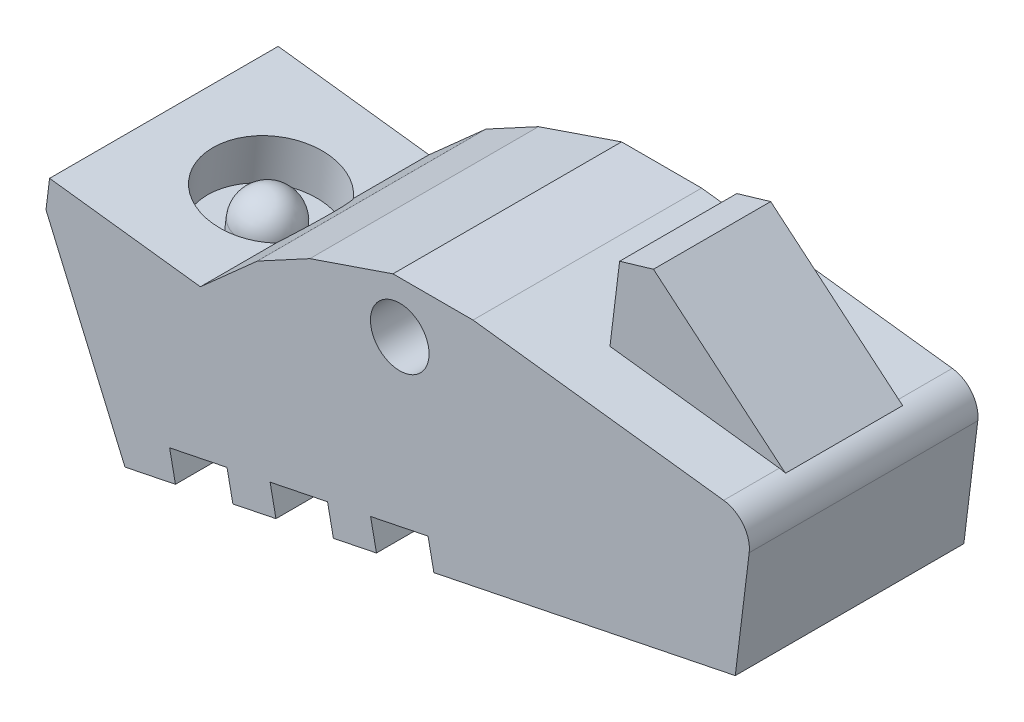
ISO-10303-21;
HEADER;
FILE_DESCRIPTION(('STEP AP214'),'2;1');
FILE_NAME('part.step','',(''),(''),'','','');
FILE_SCHEMA(('AUTOMOTIVE_DESIGN { 1 0 10303 214 1 1 1 1 }'));
ENDSEC;
DATA;
#1=APPLICATION_CONTEXT('core data for automotive mechanical design processes');
#2=APPLICATION_PROTOCOL_DEFINITION('international standard','automotive_design',2000,#1);
#3=PRODUCT_CONTEXT('',#1,'mechanical');
#4=PRODUCT('Part','Part','',(#3));
#5=PRODUCT_RELATED_PRODUCT_CATEGORY('part','',(#4));
#6=PRODUCT_DEFINITION_FORMATION('','',#4);
#7=PRODUCT_DEFINITION_CONTEXT('part definition',#1,'design');
#8=PRODUCT_DEFINITION('design','',#6,#7);
#9=PRODUCT_DEFINITION_SHAPE('','',#8);
#10=(LENGTH_UNIT() NAMED_UNIT(*) SI_UNIT(.MILLI.,.METRE.));
#11=(NAMED_UNIT(*) PLANE_ANGLE_UNIT() SI_UNIT($,.RADIAN.));
#12=(NAMED_UNIT(*) SI_UNIT($,.STERADIAN.) SOLID_ANGLE_UNIT());
#13=UNCERTAINTY_MEASURE_WITH_UNIT(LENGTH_MEASURE(1.E-05),#10,'distance_accuracy_value','');
#14=(GEOMETRIC_REPRESENTATION_CONTEXT(3) GLOBAL_UNCERTAINTY_ASSIGNED_CONTEXT((#13)) GLOBAL_UNIT_ASSIGNED_CONTEXT((#10,
#11,#12)) REPRESENTATION_CONTEXT('',''));
#15=CARTESIAN_POINT('',(0.,0.,0.));
#16=DIRECTION('',(0.,0.,1.));
#17=DIRECTION('',(1.,0.,0.));
#18=AXIS2_PLACEMENT_3D('',#15,#16,#17);
#19=CARTESIAN_POINT('',(1.29657157623182,-6.35535540642617,7.8));
#20=DIRECTION('',(-0.199894928035445,0.97981733896972,0.));
#21=DIRECTION('',(-0.97981733896972,-0.199894928035445,0.));
#22=AXIS2_PLACEMENT_3D('',#19,#20,#21);
#23=PLANE('',#22);
#24=DIRECTION('',(0.97981733896972,0.199894928035445,0.));
#25=VECTOR('',#24,1.);
#26=CARTESIAN_POINT('',(1.29657157623182,-6.35535540642617,0.));
#27=LINE('',#26,#25);
#28=CARTESIAN_POINT('',(-2.26401181136347,-7.08175871826791,0.));
#29=VERTEX_POINT('',#28);
#30=CARTESIAN_POINT('',(-0.794285802908892,-6.78191632621474,0.));
#31=VERTEX_POINT('',#30);
#32=EDGE_CURVE('E488',#29,#31,#27,.T.);
#33=ORIENTED_EDGE('',*,*,#32,.T.);
#34=DIRECTION('',(0.,0.,-1.));
#35=VECTOR('',#34,1.);
#36=CARTESIAN_POINT('',(-0.794285802908892,-6.78191632621474,7.8));
#37=LINE('',#36,#35);
#38=CARTESIAN_POINT('',(-0.794285802908892,-6.78191632621474,7.8));
#39=VERTEX_POINT('',#38);
#40=EDGE_CURVE('E518',#39,#31,#37,.T.);
#41=ORIENTED_EDGE('',*,*,#40,.F.);
#42=DIRECTION('',(0.97981733896972,0.199894928035445,0.));
#43=VECTOR('',#42,1.);
#44=CARTESIAN_POINT('',(1.29657157623182,-6.35535540642617,7.8));
#45=LINE('',#44,#43);
#46=CARTESIAN_POINT('',(-2.26401181136347,-7.08175871826791,7.8));
#47=VERTEX_POINT('',#46);
#48=EDGE_CURVE('E512',#47,#39,#45,.T.);
#49=ORIENTED_EDGE('',*,*,#48,.F.);
#50=DIRECTION('',(0.,0.,1.));
#51=VECTOR('',#50,1.);
#52=CARTESIAN_POINT('',(-2.26401181136347,-7.08175871826791,7.8));
#53=LINE('',#52,#51);
#54=EDGE_CURVE('E261',#29,#47,#53,.T.);
#55=ORIENTED_EDGE('',*,*,#54,.F.);
#56=EDGE_LOOP('',(#33,#41,#49,#55));
#57=FACE_BOUND('',#56,.T.);
#58=ADVANCED_FACE('F35',(#57),#23,.F.);
#59=CARTESIAN_POINT('',(-5.69337249775749,-7.78139096639197,0.));
#60=VERTEX_POINT('',#59);
#61=CARTESIAN_POINT('',(-4.22364648930291,-7.4815485743388,0.));
#62=VERTEX_POINT('',#61);
#63=EDGE_CURVE('E393',#60,#62,#27,.T.);
#64=ORIENTED_EDGE('',*,*,#63,.T.);
#65=DIRECTION('',(0.,0.,-1.));
#66=VECTOR('',#65,1.);
#67=CARTESIAN_POINT('',(-4.22364648930292,-7.4815485743388,7.8));
#68=LINE('',#67,#66);
#69=CARTESIAN_POINT('',(-4.22364648930292,-7.4815485743388,7.8));
#70=VERTEX_POINT('',#69);
#71=EDGE_CURVE('E271',#70,#62,#68,.T.);
#72=ORIENTED_EDGE('',*,*,#71,.F.);
#73=CARTESIAN_POINT('',(-5.69337249775749,-7.78139096639197,7.8));
#74=VERTEX_POINT('',#73);
#75=EDGE_CURVE('E360',#74,#70,#45,.T.);
#76=ORIENTED_EDGE('',*,*,#75,.F.);
#77=DIRECTION('',(0.,0.,1.));
#78=VECTOR('',#77,1.);
#79=CARTESIAN_POINT('',(-5.69337249775749,-7.78139096639197,7.8));
#80=LINE('',#79,#78);
#81=EDGE_CURVE('E287',#60,#74,#80,.T.);
#82=ORIENTED_EDGE('',*,*,#81,.F.);
#83=EDGE_LOOP('',(#64,#72,#76,#82));
#84=FACE_BOUND('',#83,.T.);
#85=ADVANCED_FACE('F499',(#84),#23,.F.);
#86=CARTESIAN_POINT('',(-9.37544654066765,-8.53257988350446,0.));
#87=VERTEX_POINT('',#86);
#88=CARTESIAN_POINT('',(-7.65300717569693,-8.18118082246286,0.));
#89=VERTEX_POINT('',#88);
#90=EDGE_CURVE('E389',#87,#89,#27,.T.);
#91=ORIENTED_EDGE('',*,*,#90,.T.);
#92=DIRECTION('',(0.,0.,-1.));
#93=VECTOR('',#92,1.);
#94=CARTESIAN_POINT('',(-7.65300717569693,-8.18118082246286,7.8));
#95=LINE('',#94,#93);
#96=CARTESIAN_POINT('',(-7.65300717569693,-8.18118082246286,7.8));
#97=VERTEX_POINT('',#96);
#98=EDGE_CURVE('E276',#97,#89,#95,.T.);
#99=ORIENTED_EDGE('',*,*,#98,.F.);
#100=CARTESIAN_POINT('',(-9.37544654066765,-8.53257988350446,7.8));
#101=VERTEX_POINT('',#100);
#102=EDGE_CURVE('E356',#101,#97,#45,.T.);
#103=ORIENTED_EDGE('',*,*,#102,.F.);
#104=DIRECTION('',(0.,0.,-1.));
#105=VECTOR('',#104,1.);
#106=CARTESIAN_POINT('',(-9.37544654066765,-8.53257988350446,7.8));
#107=LINE('',#106,#105);
#108=EDGE_CURVE('E400',#101,#87,#107,.T.);
#109=ORIENTED_EDGE('',*,*,#108,.T.);
#110=EDGE_LOOP('',(#91,#99,#103,#109));
#111=FACE_BOUND('',#110,.T.);
#112=ADVANCED_FACE('F539',(#111),#23,.F.);
#113=CARTESIAN_POINT('',(0.248812000804471,2.0264111299909,7.8));
#114=DIRECTION('',(0.121869343405041,0.992546151641335,0.));
#115=DIRECTION('',(-0.992546151641335,0.121869343405041,0.));
#116=AXIS2_PLACEMENT_3D('',#113,#114,#115);
#117=PLANE('',#116);
#118=DIRECTION('',(0.992546151641335,-0.121869343405041,0.));
#119=VECTOR('',#118,1.);
#120=CARTESIAN_POINT('',(0.248812000804471,2.0264111299909,7.8));
#121=LINE('',#120,#119);
#122=CARTESIAN_POINT('',(2.5,1.75000000000003,7.8));
#123=VERTEX_POINT('',#122);
#124=CARTESIAN_POINT('',(11.0530836565726,0.699813378862885,7.8));
#125=VERTEX_POINT('',#124);
#126=EDGE_CURVE('E362',#123,#125,#121,.T.);
#127=ORIENTED_EDGE('',*,*,#126,.T.);
#128=DIRECTION('',(0.,0.,-1.));
#129=VECTOR('',#128,1.);
#130=CARTESIAN_POINT('',(11.0530836565726,0.699813378862885,7.8));
#131=LINE('',#130,#129);
#132=CARTESIAN_POINT('',(11.0530836565725,0.699813378861765,5.9));
#133=VERTEX_POINT('',#132);
#134=EDGE_CURVE('E436',#125,#133,#131,.T.);
#135=ORIENTED_EDGE('',*,*,#134,.T.);
#136=DIRECTION('',(0.992546151641322,-0.121869343405144,0.));
#137=VECTOR('',#136,1.);
#138=CARTESIAN_POINT('',(5.27319145931153,1.40949490436855,5.9));
#139=LINE('',#138,#137);
#140=CARTESIAN_POINT('',(5.27319145931153,1.40949490436908,5.9));
#141=VERTEX_POINT('',#140);
#142=EDGE_CURVE('E322',#141,#133,#139,.T.);
#143=ORIENTED_EDGE('',*,*,#142,.F.);
#144=DIRECTION('',(0.,0.,1.));
#145=VECTOR('',#144,1.);
#146=CARTESIAN_POINT('',(5.27319145931153,1.40949490436855,1.9));
#147=LINE('',#146,#145);
#148=CARTESIAN_POINT('',(5.27319145931153,1.40949490436855,1.9));
#149=VERTEX_POINT('',#148);
#150=EDGE_CURVE('E319',#149,#141,#147,.T.);
#151=ORIENTED_EDGE('',*,*,#150,.F.);
#152=DIRECTION('',(-0.992546151641322,0.121869343405144,0.));
#153=VECTOR('',#152,1.);
#154=CARTESIAN_POINT('',(5.27319145931153,1.40949490436855,1.9));
#155=LINE('',#154,#153);
#156=CARTESIAN_POINT('',(11.0530836565725,0.699813378861765,1.9));
#157=VERTEX_POINT('',#156);
#158=EDGE_CURVE('E317',#157,#149,#155,.T.);
#159=ORIENTED_EDGE('',*,*,#158,.F.);
#160=DIRECTION('',(0.,0.,-1.));
#161=VECTOR('',#160,1.);
#162=CARTESIAN_POINT('',(11.0530836565726,0.699813378862885,7.8));
#163=LINE('',#162,#161);
#164=CARTESIAN_POINT('',(11.0530836565726,0.699813378862885,0.));
#165=VERTEX_POINT('',#164);
#166=EDGE_CURVE('E434',#157,#165,#163,.T.);
#167=ORIENTED_EDGE('',*,*,#166,.T.);
#168=DIRECTION('',(0.992546151641335,-0.121869343405041,0.));
#169=VECTOR('',#168,1.);
#170=CARTESIAN_POINT('',(0.248812000804471,2.0264111299909,0.));
#171=LINE('',#170,#169);
#172=CARTESIAN_POINT('',(2.5,1.75000000000003,0.));
#173=VERTEX_POINT('',#172);
#174=EDGE_CURVE('E335',#173,#165,#171,.T.);
#175=ORIENTED_EDGE('',*,*,#174,.F.);
#176=DIRECTION('',(0.,0.,-1.));
#177=VECTOR('',#176,1.);
#178=CARTESIAN_POINT('',(2.5,1.75000000000003,7.8));
#179=LINE('',#178,#177);
#180=EDGE_CURVE('E365',#123,#173,#179,.T.);
#181=ORIENTED_EDGE('',*,*,#180,.F.);
#182=EDGE_LOOP('',(#127,#135,#143,#151,#159,#167,#175,#181));
#183=FACE_BOUND('',#182,.T.);
#184=ADVANCED_FACE('F458',(#183),#117,.T.);
#185=CARTESIAN_POINT('',(0.,1.75000000000004,7.8));
#186=DIRECTION('',(0.,1.,0.));
#187=DIRECTION('',(-1.,0.,0.));
#188=AXIS2_PLACEMENT_3D('',#185,#186,#187);
#189=PLANE('',#188);
#190=DIRECTION('',(1.,0.,0.));
#191=VECTOR('',#190,1.);
#192=CARTESIAN_POINT('',(0.,1.75000000000004,0.));
#193=LINE('',#192,#191);
#194=CARTESIAN_POINT('',(-0.230903775001697,1.75000000000004,0.));
#195=VERTEX_POINT('',#194);
#196=EDGE_CURVE('E368',#195,#173,#193,.T.);
#197=ORIENTED_EDGE('',*,*,#196,.F.);
#198=DIRECTION('',(0.,0.,-1.));
#199=VECTOR('',#198,1.);
#200=CARTESIAN_POINT('',(-0.230903775001697,1.75000000000004,7.8));
#201=LINE('',#200,#199);
#202=CARTESIAN_POINT('',(-0.230903775001697,1.75000000000004,7.8));
#203=VERTEX_POINT('',#202);
#204=EDGE_CURVE('E417',#203,#195,#201,.T.);
#205=ORIENTED_EDGE('',*,*,#204,.F.);
#206=DIRECTION('',(1.,0.,0.));
#207=VECTOR('',#206,1.);
#208=CARTESIAN_POINT('',(0.,1.75000000000004,7.8));
#209=LINE('',#208,#207);
#210=EDGE_CURVE('E334',#203,#123,#209,.T.);
#211=ORIENTED_EDGE('',*,*,#210,.T.);
#212=ORIENTED_EDGE('',*,*,#180,.T.);
#213=EDGE_LOOP('',(#197,#205,#211,#212));
#214=FACE_BOUND('',#213,.T.);
#215=ADVANCED_FACE('F556',(#214),#189,.T.);
#216=CARTESIAN_POINT('',(-0.559340332201452,1.63783496707273,7.8));
#217=DIRECTION('',(0.32318504904412,-0.946335788224428,0.));
#218=DIRECTION('',(0.946335788224428,0.32318504904412,0.));
#219=AXIS2_PLACEMENT_3D('',#216,#217,#218);
#220=PLANE('',#219);
#221=DIRECTION('',(-0.946335788224428,-0.32318504904412,0.));
#222=VECTOR('',#221,1.);
#223=CARTESIAN_POINT('',(-0.559340332201452,1.63783496707273,0.));
#224=LINE('',#223,#222);
#225=CARTESIAN_POINT('',(-3.06505134731478,0.782104530385764,0.));
#226=VERTEX_POINT('',#225);
#227=EDGE_CURVE('E371',#195,#226,#224,.T.);
#228=ORIENTED_EDGE('',*,*,#227,.T.);
#229=DIRECTION('',(0.,0.,-1.));
#230=VECTOR('',#229,1.);
#231=CARTESIAN_POINT('',(-3.06505134731478,0.782104530385764,7.8));
#232=LINE('',#231,#230);
#233=CARTESIAN_POINT('',(-3.06505134731478,0.782104530385764,7.8));
#234=VERTEX_POINT('',#233);
#235=EDGE_CURVE('E414',#234,#226,#232,.T.);
#236=ORIENTED_EDGE('',*,*,#235,.F.);
#237=DIRECTION('',(-0.946335788224428,-0.32318504904412,0.));
#238=VECTOR('',#237,1.);
#239=CARTESIAN_POINT('',(-0.559340332201452,1.63783496707273,7.8));
#240=LINE('',#239,#238);
#241=EDGE_CURVE('E338',#203,#234,#240,.T.);
#242=ORIENTED_EDGE('',*,*,#241,.F.);
#243=ORIENTED_EDGE('',*,*,#204,.T.);
#244=EDGE_LOOP('',(#228,#236,#242,#243));
#245=FACE_BOUND('',#244,.T.);
#246=ADVANCED_FACE('F587',(#245),#220,.F.);
#247=CARTESIAN_POINT('',(-1.01880710361026,1.88692994913641,7.8));
#248=DIRECTION('',(0.475100147615671,-0.879931730156134,0.));
#249=DIRECTION('',(0.879931730156134,0.475100147615671,0.));
#250=AXIS2_PLACEMENT_3D('',#247,#248,#249);
#251=PLANE('',#250);
#252=DIRECTION('',(-0.879931730156134,-0.475100147615671,0.));
#253=VECTOR('',#252,1.);
#254=CARTESIAN_POINT('',(-1.01880710361026,1.88692994913641,0.));
#255=LINE('',#254,#253);
#256=CARTESIAN_POINT('',(-4.85768799342445,-0.185790939228501,0.));
#257=VERTEX_POINT('',#256);
#258=EDGE_CURVE('E374',#226,#257,#255,.T.);
#259=ORIENTED_EDGE('',*,*,#258,.T.);
#260=DIRECTION('',(0.,0.,-1.));
#261=VECTOR('',#260,1.);
#262=CARTESIAN_POINT('',(-4.85768799342445,-0.185790939228501,7.8));
#263=LINE('',#262,#261);
#264=CARTESIAN_POINT('',(-4.85768799342445,-0.185790939228501,7.8));
#265=VERTEX_POINT('',#264);
#266=EDGE_CURVE('E411',#265,#257,#263,.T.);
#267=ORIENTED_EDGE('',*,*,#266,.F.);
#268=DIRECTION('',(-0.879931730156134,-0.475100147615671,0.));
#269=VECTOR('',#268,1.);
#270=CARTESIAN_POINT('',(-1.01880710361026,1.88692994913641,7.8));
#271=LINE('',#270,#269);
#272=EDGE_CURVE('E341',#234,#265,#271,.T.);
#273=ORIENTED_EDGE('',*,*,#272,.F.);
#274=ORIENTED_EDGE('',*,*,#235,.T.);
#275=EDGE_LOOP('',(#259,#267,#273,#274));
#276=FACE_BOUND('',#275,.T.);
#277=ADVANCED_FACE('F580',(#276),#251,.F.);
#278=CARTESIAN_POINT('',(-2.05638381124912,2.30901754689668,7.8));
#279=DIRECTION('',(0.665072440501903,-0.746778848712819,0.));
#280=DIRECTION('',(0.746778848712819,0.665072440501903,0.));
#281=AXIS2_PLACEMENT_3D('',#278,#279,#280);
#282=PLANE('',#281);
#283=DIRECTION('',(0.,0.,-1.));
#284=VECTOR('',#283,1.);
#285=CARTESIAN_POINT('',(-6.80260083088496,-1.91790738789719,7.8));
#286=LINE('',#285,#284);
#287=CARTESIAN_POINT('',(-6.80260083088496,-1.91790738789719,2.57712434446771));
#288=VERTEX_POINT('',#287);
#289=CARTESIAN_POINT('',(-6.80260083088496,-1.91790738789719,0.));
#290=VERTEX_POINT('',#289);
#291=EDGE_CURVE('E407',#288,#290,#286,.T.);
#292=ORIENTED_EDGE('',*,*,#291,.F.);
#293=CARTESIAN_POINT('',(-8.49941277411357,-3.42906810448814,3.9));
#294=DIRECTION('',(0.665072440501903,-0.746778848712819,0.));
#295=DIRECTION('',(0.746778848712819,0.665072440501903,0.));
#296=AXIS2_PLACEMENT_3D('',#293,#294,#295);
#297=ELLIPSE('',#296,3.02956615362688,2.);
#298=CARTESIAN_POINT('',(-6.80260083088496,-1.91790738789719,5.22287565553229));
#299=VERTEX_POINT('',#298);
#300=EDGE_CURVE('E314',#288,#299,#297,.T.);
#301=ORIENTED_EDGE('',*,*,#300,.T.);
#302=CARTESIAN_POINT('',(-6.80260083088496,-1.91790738789719,7.8));
#303=VERTEX_POINT('',#302);
#304=EDGE_CURVE('E408',#303,#299,#286,.T.);
#305=ORIENTED_EDGE('',*,*,#304,.F.);
#306=DIRECTION('',(-0.746778848712819,-0.665072440501903,0.));
#307=VECTOR('',#306,1.);
#308=CARTESIAN_POINT('',(-2.05638381124912,2.30901754689668,7.8));
#309=LINE('',#308,#307);
#310=EDGE_CURVE('E344',#265,#303,#309,.T.);
#311=ORIENTED_EDGE('',*,*,#310,.F.);
#312=ORIENTED_EDGE('',*,*,#266,.T.);
#313=DIRECTION('',(-0.746778848712819,-0.665072440501903,0.));
#314=VECTOR('',#313,1.);
#315=CARTESIAN_POINT('',(-2.05638381124912,2.30901754689668,0.));
#316=LINE('',#315,#314);
#317=EDGE_CURVE('E377',#257,#290,#316,.T.);
#318=ORIENTED_EDGE('',*,*,#317,.T.);
#319=EDGE_LOOP('',(#292,#301,#305,#311,#312,#318));
#320=FACE_BOUND('',#319,.T.);
#321=ADVANCED_FACE('F576',(#320),#282,.F.);
#322=CARTESIAN_POINT('',(-0.333025053990206,-2.71227140889126,7.8));
#323=DIRECTION('',(0.121869343405144,0.992546151641323,0.));
#324=DIRECTION('',(-0.992546151641323,0.121869343405144,0.));
#325=AXIS2_PLACEMENT_3D('',#322,#323,#324);
#326=PLANE('',#325);
#327=CARTESIAN_POINT('',(-8.29142005834695,-1.73510337278948,3.9));
#328=DIRECTION('',(0.121869343405144,0.992546151641323,0.));
#329=DIRECTION('',(-0.992546151641323,0.121869343405144,0.));
#330=AXIS2_PLACEMENT_3D('',#327,#328,#329);
#331=CIRCLE('',#330,2.);
#332=EDGE_CURVE('E429',#288,#299,#331,.T.);
#333=ORIENTED_EDGE('',*,*,#332,.F.);
#334=ORIENTED_EDGE('',*,*,#291,.T.);
#335=DIRECTION('',(0.992546151641322,-0.121869343405144,0.));
#336=VECTOR('',#335,1.);
#337=CARTESIAN_POINT('',(-0.333025053990206,-2.71227140889126,0.));
#338=LINE('',#337,#336);
#339=CARTESIAN_POINT('',(-11.9482922504503,-1.28609592640403,0.));
#340=VERTEX_POINT('',#339);
#341=EDGE_CURVE('E380',#340,#290,#338,.T.);
#342=ORIENTED_EDGE('',*,*,#341,.F.);
#343=DIRECTION('',(0.,0.,-1.));
#344=VECTOR('',#343,1.);
#345=CARTESIAN_POINT('',(-11.9482922504503,-1.28609592640403,7.8));
#346=LINE('',#345,#344);
#347=CARTESIAN_POINT('',(-11.9482922504503,-1.28609592640403,7.8));
#348=VERTEX_POINT('',#347);
#349=EDGE_CURVE('E405',#348,#340,#346,.T.);
#350=ORIENTED_EDGE('',*,*,#349,.F.);
#351=DIRECTION('',(0.992546151641322,-0.121869343405144,0.));
#352=VECTOR('',#351,1.);
#353=CARTESIAN_POINT('',(-0.333025053990206,-2.71227140889126,7.8));
#354=LINE('',#353,#352);
#355=EDGE_CURVE('E346',#348,#303,#354,.T.);
#356=ORIENTED_EDGE('',*,*,#355,.T.);
#357=ORIENTED_EDGE('',*,*,#304,.T.);
#358=EDGE_LOOP('',(#333,#334,#342,#350,#356,#357));
#359=FACE_BOUND('',#358,.T.);
#360=ADVANCED_FACE('F573',(#359),#326,.T.);
#361=CARTESIAN_POINT('',(-11.6152671964601,1.42617548248722,7.8));
#362=DIRECTION('',(-0.992546151641323,0.121869343405143,0.));
#363=DIRECTION('',(-0.121869343405143,-0.992546151641323,0.));
#364=AXIS2_PLACEMENT_3D('',#361,#362,#363);
#365=PLANE('',#364);
#366=DIRECTION('',(0.121869343405143,0.992546151641323,0.));
#367=VECTOR('',#366,1.);
#368=CARTESIAN_POINT('',(-11.6152671964601,1.42617548248722,0.));
#369=LINE('',#368,#367);
#370=CARTESIAN_POINT('',(-12.0702540368398,-2.2793949657348,0.));
#371=VERTEX_POINT('',#370);
#372=EDGE_CURVE('E383',#371,#340,#369,.T.);
#373=ORIENTED_EDGE('',*,*,#372,.F.);
#374=DIRECTION('',(0.,0.,-1.));
#375=VECTOR('',#374,1.);
#376=CARTESIAN_POINT('',(-12.0702540368398,-2.2793949657348,7.8));
#377=LINE('',#376,#375);
#378=CARTESIAN_POINT('',(-12.0702540368398,-2.2793949657348,7.8));
#379=VERTEX_POINT('',#378);
#380=EDGE_CURVE('E403',#379,#371,#377,.T.);
#381=ORIENTED_EDGE('',*,*,#380,.F.);
#382=DIRECTION('',(0.121869343405143,0.992546151641323,0.));
#383=VECTOR('',#382,1.);
#384=CARTESIAN_POINT('',(-11.6152671964601,1.42617548248722,7.8));
#385=LINE('',#384,#383);
#386=EDGE_CURVE('E349',#379,#348,#385,.T.);
#387=ORIENTED_EDGE('',*,*,#386,.T.);
#388=ORIENTED_EDGE('',*,*,#349,.T.);
#389=EDGE_LOOP('',(#373,#381,#387,#388));
#390=FACE_BOUND('',#389,.T.);
#391=ADVANCED_FACE('F549',(#390),#365,.T.);
#392=CARTESIAN_POINT('',(-11.0081514352015,-4.74395838227671,7.8));
#393=DIRECTION('',(0.91835242192857,0.395763602593682,0.));
#394=DIRECTION('',(-0.395763602593682,0.91835242192857,0.));
#395=AXIS2_PLACEMENT_3D('',#392,#393,#394);
#396=PLANE('',#395);
#397=DIRECTION('',(0.395763602593682,-0.91835242192857,0.));
#398=VECTOR('',#397,1.);
#399=CARTESIAN_POINT('',(-11.0081514352015,-4.74395838227671,0.));
#400=LINE('',#399,#398);
#401=EDGE_CURVE('E386',#371,#87,#400,.T.);
#402=ORIENTED_EDGE('',*,*,#401,.T.);
#403=ORIENTED_EDGE('',*,*,#108,.F.);
#404=DIRECTION('',(0.395763602593682,-0.91835242192857,0.));
#405=VECTOR('',#404,1.);
#406=CARTESIAN_POINT('',(-11.0081514352015,-4.74395838227671,7.8));
#407=LINE('',#406,#405);
#408=EDGE_CURVE('E352',#379,#101,#407,.T.);
#409=ORIENTED_EDGE('',*,*,#408,.F.);
#410=ORIENTED_EDGE('',*,*,#380,.T.);
#411=EDGE_LOOP('',(#402,#403,#409,#410));
#412=FACE_BOUND('',#411,.T.);
#413=ADVANCED_FACE('F543',(#412),#396,.F.);
#414=CARTESIAN_POINT('',(1.16534887503055,-6.38212647014385,7.8));
#415=VERTEX_POINT('',#414);
#416=CARTESIAN_POINT('',(11.4486325243259,-4.28420866109036,7.8));
#417=VERTEX_POINT('',#416);
#418=EDGE_CURVE('E355',#415,#417,#45,.T.);
#419=ORIENTED_EDGE('',*,*,#418,.F.);
#420=DIRECTION('',(0.,0.,1.));
#421=VECTOR('',#420,1.);
#422=CARTESIAN_POINT('',(1.16534887503055,-6.38212647014385,7.8));
#423=LINE('',#422,#421);
#424=CARTESIAN_POINT('',(1.16534887503055,-6.38212647014385,0.));
#425=VERTEX_POINT('',#424);
#426=EDGE_CURVE('E487',#425,#415,#423,.T.);
#427=ORIENTED_EDGE('',*,*,#426,.F.);
#428=CARTESIAN_POINT('',(11.4486325243259,-4.28420866109036,0.));
#429=VERTEX_POINT('',#428);
#430=EDGE_CURVE('E250',#425,#429,#27,.T.);
#431=ORIENTED_EDGE('',*,*,#430,.T.);
#432=DIRECTION('',(0.,0.,-1.));
#433=VECTOR('',#432,1.);
#434=CARTESIAN_POINT('',(11.4486325243259,-4.28420866109036,7.8));
#435=LINE('',#434,#433);
#436=EDGE_CURVE('E397',#417,#429,#435,.T.);
#437=ORIENTED_EDGE('',*,*,#436,.F.);
#438=EDGE_LOOP('',(#419,#427,#431,#437));
#439=FACE_BOUND('',#438,.T.);
#440=ADVANCED_FACE('F486',(#439),#23,.F.);
#441=CARTESIAN_POINT('',(11.7968178074095,-1.44846709453305,7.8));
#442=DIRECTION('',(0.992546151641335,-0.121869343405041,0.));
#443=DIRECTION('',(0.121869343405041,0.992546151641335,0.));
#444=AXIS2_PLACEMENT_3D('',#441,#442,#443);
#445=PLANE('',#444);
#446=DIRECTION('',(-0.121869343405041,-0.992546151641335,0.));
#447=VECTOR('',#446,1.);
#448=CARTESIAN_POINT('',(11.7968178074095,-1.44846709453305,0.));
#449=LINE('',#448,#447);
#450=CARTESIAN_POINT('',(11.9237604648089,-0.414602116183491,0.));
#451=VERTEX_POINT('',#450);
#452=EDGE_CURVE('E392',#451,#429,#449,.T.);
#453=ORIENTED_EDGE('',*,*,#452,.F.);
#454=DIRECTION('',(0.,0.,-1.));
#455=VECTOR('',#454,1.);
#456=CARTESIAN_POINT('',(11.9237604648089,-0.414602116183491,7.8));
#457=LINE('',#456,#455);
#458=CARTESIAN_POINT('',(11.9237604648089,-0.414602116183491,7.8));
#459=VERTEX_POINT('',#458);
#460=EDGE_CURVE('E441',#451,#459,#457,.F.);
#461=ORIENTED_EDGE('',*,*,#460,.T.);
#462=DIRECTION('',(-0.121869343405041,-0.992546151641335,0.));
#463=VECTOR('',#462,1.);
#464=CARTESIAN_POINT('',(11.7968178074095,-1.44846709453305,7.8));
#465=LINE('',#464,#463);
#466=EDGE_CURVE('E359',#459,#417,#465,.T.);
#467=ORIENTED_EDGE('',*,*,#466,.T.);
#468=ORIENTED_EDGE('',*,*,#436,.T.);
#469=EDGE_LOOP('',(#453,#461,#467,#468));
#470=FACE_BOUND('',#469,.T.);
#471=ADVANCED_FACE('F482',(#470),#445,.T.);
#472=CARTESIAN_POINT('',(0.,0.,7.8));
#473=DIRECTION('',(0.,0.,-1.));
#474=DIRECTION('',(-1.,0.,0.));
#475=AXIS2_PLACEMENT_3D('',#472,#473,#474);
#476=CYLINDRICAL_SURFACE('',#475,1.);
#477=CARTESIAN_POINT('',(0.,0.,7.8));
#478=DIRECTION('',(0.,0.,1.));
#479=DIRECTION('',(1.,0.,0.));
#480=AXIS2_PLACEMENT_3D('',#477,#478,#479);
#481=CIRCLE('',#480,1.);
#482=CARTESIAN_POINT('',(1.,0.,7.8));
#483=VERTEX_POINT('',#482);
#484=EDGE_CURVE('E331',#483,#483,#481,.T.);
#485=ORIENTED_EDGE('',*,*,#484,.T.);
#486=EDGE_LOOP('',(#485));
#487=FACE_BOUND('',#486,.T.);
#488=CARTESIAN_POINT('',(0.,0.,0.));
#489=DIRECTION('',(0.,0.,1.));
#490=DIRECTION('',(1.,0.,0.));
#491=AXIS2_PLACEMENT_3D('',#488,#489,#490);
#492=CIRCLE('',#491,1.);
#493=CARTESIAN_POINT('',(1.,0.,0.));
#494=VERTEX_POINT('',#493);
#495=EDGE_CURVE('E330',#494,#494,#492,.T.);
#496=ORIENTED_EDGE('',*,*,#495,.F.);
#497=EDGE_LOOP('',(#496));
#498=FACE_BOUND('',#497,.T.);
#499=ADVANCED_FACE('F548',(#487,#498),#476,.F.);
#500=CARTESIAN_POINT('',(0.,0.,7.8));
#501=DIRECTION('',(0.,0.,1.));
#502=DIRECTION('',(1.,0.,0.));
#503=AXIS2_PLACEMENT_3D('',#500,#501,#502);
#504=PLANE('',#503);
#505=ORIENTED_EDGE('',*,*,#466,.F.);
#506=CARTESIAN_POINT('',(10.9312143131676,-0.29273277277845,7.8));
#507=DIRECTION('',(0.,0.,1.));
#508=DIRECTION('',(1.,0.,0.));
#509=AXIS2_PLACEMENT_3D('',#506,#507,#508);
#510=CIRCLE('',#509,1.);
#511=EDGE_CURVE('E443',#459,#125,#510,.T.);
#512=ORIENTED_EDGE('',*,*,#511,.T.);
#513=ORIENTED_EDGE('',*,*,#126,.F.);
#514=ORIENTED_EDGE('',*,*,#210,.F.);
#515=ORIENTED_EDGE('',*,*,#241,.T.);
#516=ORIENTED_EDGE('',*,*,#272,.T.);
#517=ORIENTED_EDGE('',*,*,#310,.T.);
#518=ORIENTED_EDGE('',*,*,#355,.F.);
#519=ORIENTED_EDGE('',*,*,#386,.F.);
#520=ORIENTED_EDGE('',*,*,#408,.T.);
#521=ORIENTED_EDGE('',*,*,#102,.T.);
#522=DIRECTION('',(0.199894928035445,-0.979817338969721,0.));
#523=VECTOR('',#522,1.);
#524=CARTESIAN_POINT('',(-7.85290210373238,-7.20136348349314,7.8));
#525=LINE('',#524,#523);
#526=CARTESIAN_POINT('',(-7.85290210373238,-7.20136348349314,7.8));
#527=VERTEX_POINT('',#526);
#528=EDGE_CURVE('E299',#527,#97,#525,.T.);
#529=ORIENTED_EDGE('',*,*,#528,.F.);
#530=DIRECTION('',(-0.979817338969721,-0.199894928035445,0.));
#531=VECTOR('',#530,1.);
#532=CARTESIAN_POINT('',(-7.85290210373238,-7.20136348349314,7.8));
#533=LINE('',#532,#531);
#534=CARTESIAN_POINT('',(-5.89326742579294,-6.80157362742225,7.8));
#535=VERTEX_POINT('',#534);
#536=EDGE_CURVE('E293',#535,#527,#533,.T.);
#537=ORIENTED_EDGE('',*,*,#536,.F.);
#538=DIRECTION('',(0.199894928035445,-0.979817338969721,0.));
#539=VECTOR('',#538,1.);
#540=CARTESIAN_POINT('',(-5.89326742579294,-6.80157362742225,7.8));
#541=LINE('',#540,#539);
#542=EDGE_CURVE('E302',#535,#74,#541,.T.);
#543=ORIENTED_EDGE('',*,*,#542,.T.);
#544=ORIENTED_EDGE('',*,*,#75,.T.);
#545=DIRECTION('',(0.199894928035445,-0.979817338969721,0.));
#546=VECTOR('',#545,1.);
#547=CARTESIAN_POINT('',(-4.42354141733836,-6.50173123536908,7.8));
#548=LINE('',#547,#546);
#549=CARTESIAN_POINT('',(-4.42354141733836,-6.50173123536908,7.8));
#550=VERTEX_POINT('',#549);
#551=EDGE_CURVE('E274',#550,#70,#548,.T.);
#552=ORIENTED_EDGE('',*,*,#551,.F.);
#553=DIRECTION('',(-0.97981733896972,-0.199894928035446,0.));
#554=VECTOR('',#553,1.);
#555=CARTESIAN_POINT('',(-4.42354141733836,-6.50173123536908,7.8));
#556=LINE('',#555,#554);
#557=CARTESIAN_POINT('',(-2.46390673939892,-6.10194137929819,7.8));
#558=VERTEX_POINT('',#557);
#559=EDGE_CURVE('E267',#558,#550,#556,.T.);
#560=ORIENTED_EDGE('',*,*,#559,.F.);
#561=DIRECTION('',(0.199894928035445,-0.979817338969721,0.));
#562=VECTOR('',#561,1.);
#563=CARTESIAN_POINT('',(-2.46390673939892,-6.10194137929819,7.8));
#564=LINE('',#563,#562);
#565=EDGE_CURVE('E277',#558,#47,#564,.T.);
#566=ORIENTED_EDGE('',*,*,#565,.T.);
#567=ORIENTED_EDGE('',*,*,#48,.T.);
#568=DIRECTION('',(0.199894928035445,-0.979817338969721,0.));
#569=VECTOR('',#568,1.);
#570=CARTESIAN_POINT('',(-0.994180730944338,-5.80209898724502,7.8));
#571=LINE('',#570,#569);
#572=CARTESIAN_POINT('',(-0.994180730944338,-5.80209898724502,7.8));
#573=VERTEX_POINT('',#572);
#574=EDGE_CURVE('E253',#573,#39,#571,.T.);
#575=ORIENTED_EDGE('',*,*,#574,.F.);
#576=DIRECTION('',(-0.979817338969721,-0.199894928035445,0.));
#577=VECTOR('',#576,1.);
#578=CARTESIAN_POINT('',(-0.994180730944338,-5.80209898724502,7.8));
#579=LINE('',#578,#577);
#580=CARTESIAN_POINT('',(0.965453946995103,-5.40230913117413,7.8));
#581=VERTEX_POINT('',#580);
#582=EDGE_CURVE('E236',#581,#573,#579,.T.);
#583=ORIENTED_EDGE('',*,*,#582,.F.);
#584=DIRECTION('',(0.199894928035445,-0.979817338969721,0.));
#585=VECTOR('',#584,1.);
#586=CARTESIAN_POINT('',(0.965453946995103,-5.40230913117413,7.8));
#587=LINE('',#586,#585);
#588=EDGE_CURVE('E232',#581,#415,#587,.T.);
#589=ORIENTED_EDGE('',*,*,#588,.T.);
#590=ORIENTED_EDGE('',*,*,#418,.T.);
#591=EDGE_LOOP('',(#505,#512,#513,#514,#515,#516,#517,#518,#519,#520,#521,#529,#537,#543,#544,
#552,#560,#566,#567,#575,#583,#589,#590));
#592=FACE_BOUND('',#591,.T.);
#593=ORIENTED_EDGE('',*,*,#484,.F.);
#594=EDGE_LOOP('',(#593));
#595=FACE_BOUND('',#594,.T.);
#596=ADVANCED_FACE('F476',(#592,#595),#504,.T.);
#597=CARTESIAN_POINT('',(0.,0.,0.));
#598=DIRECTION('',(0.,0.,1.));
#599=DIRECTION('',(1.,0.,0.));
#600=AXIS2_PLACEMENT_3D('',#597,#598,#599);
#601=PLANE('',#600);
#602=ORIENTED_EDGE('',*,*,#495,.T.);
#603=EDGE_LOOP('',(#602));
#604=FACE_BOUND('',#603,.T.);
#605=ORIENTED_EDGE('',*,*,#174,.T.);
#606=CARTESIAN_POINT('',(10.9312143131676,-0.29273277277845,0.));
#607=DIRECTION('',(0.,0.,1.));
#608=DIRECTION('',(1.,0.,0.));
#609=AXIS2_PLACEMENT_3D('',#606,#607,#608);
#610=CIRCLE('',#609,1.);
#611=EDGE_CURVE('E439',#165,#451,#610,.F.);
#612=ORIENTED_EDGE('',*,*,#611,.T.);
#613=ORIENTED_EDGE('',*,*,#452,.T.);
#614=ORIENTED_EDGE('',*,*,#430,.F.);
#615=DIRECTION('',(0.199894928035445,-0.979817338969721,0.));
#616=VECTOR('',#615,1.);
#617=CARTESIAN_POINT('',(0.965453946995103,-5.40230913117413,0.));
#618=LINE('',#617,#616);
#619=CARTESIAN_POINT('',(0.965453946995103,-5.40230913117413,0.));
#620=VERTEX_POINT('',#619);
#621=EDGE_CURVE('E229',#620,#425,#618,.T.);
#622=ORIENTED_EDGE('',*,*,#621,.F.);
#623=DIRECTION('',(0.979817338969721,0.199894928035445,0.));
#624=VECTOR('',#623,1.);
#625=CARTESIAN_POINT('',(-0.994180730944337,-5.80209898724502,0.));
#626=LINE('',#625,#624);
#627=CARTESIAN_POINT('',(-0.994180730944338,-5.80209898724502,0.));
#628=VERTEX_POINT('',#627);
#629=EDGE_CURVE('E237',#628,#620,#626,.T.);
#630=ORIENTED_EDGE('',*,*,#629,.F.);
#631=DIRECTION('',(0.199894928035445,-0.979817338969721,0.));
#632=VECTOR('',#631,1.);
#633=CARTESIAN_POINT('',(-0.994180730944337,-5.80209898724502,0.));
#634=LINE('',#633,#632);
#635=EDGE_CURVE('E251',#628,#31,#634,.T.);
#636=ORIENTED_EDGE('',*,*,#635,.T.);
#637=ORIENTED_EDGE('',*,*,#32,.F.);
#638=DIRECTION('',(0.199894928035445,-0.979817338969721,0.));
#639=VECTOR('',#638,1.);
#640=CARTESIAN_POINT('',(-2.46390673939892,-6.10194137929819,0.));
#641=LINE('',#640,#639);
#642=CARTESIAN_POINT('',(-2.46390673939892,-6.10194137929819,0.));
#643=VERTEX_POINT('',#642);
#644=EDGE_CURVE('E280',#643,#29,#641,.T.);
#645=ORIENTED_EDGE('',*,*,#644,.F.);
#646=DIRECTION('',(0.979817338969721,0.199894928035445,0.));
#647=VECTOR('',#646,1.);
#648=CARTESIAN_POINT('',(-4.42354141733836,-6.50173123536908,0.));
#649=LINE('',#648,#647);
#650=CARTESIAN_POINT('',(-4.42354141733836,-6.50173123536908,0.));
#651=VERTEX_POINT('',#650);
#652=EDGE_CURVE('E260',#651,#643,#649,.T.);
#653=ORIENTED_EDGE('',*,*,#652,.F.);
#654=DIRECTION('',(0.199894928035445,-0.979817338969721,0.));
#655=VECTOR('',#654,1.);
#656=CARTESIAN_POINT('',(-4.42354141733836,-6.50173123536908,0.));
#657=LINE('',#656,#655);
#658=EDGE_CURVE('E270',#651,#62,#657,.T.);
#659=ORIENTED_EDGE('',*,*,#658,.T.);
#660=ORIENTED_EDGE('',*,*,#63,.F.);
#661=DIRECTION('',(0.199894928035445,-0.979817338969721,0.));
#662=VECTOR('',#661,1.);
#663=CARTESIAN_POINT('',(-5.89326742579294,-6.80157362742225,0.));
#664=LINE('',#663,#662);
#665=CARTESIAN_POINT('',(-5.89326742579294,-6.80157362742225,0.));
#666=VERTEX_POINT('',#665);
#667=EDGE_CURVE('E305',#666,#60,#664,.T.);
#668=ORIENTED_EDGE('',*,*,#667,.F.);
#669=DIRECTION('',(0.979817338969721,0.199894928035445,0.));
#670=VECTOR('',#669,1.);
#671=CARTESIAN_POINT('',(-7.85290210373238,-7.20136348349314,0.));
#672=LINE('',#671,#670);
#673=CARTESIAN_POINT('',(-7.85290210373238,-7.20136348349314,0.));
#674=VERTEX_POINT('',#673);
#675=EDGE_CURVE('E286',#674,#666,#672,.T.);
#676=ORIENTED_EDGE('',*,*,#675,.F.);
#677=DIRECTION('',(0.199894928035445,-0.979817338969721,0.));
#678=VECTOR('',#677,1.);
#679=CARTESIAN_POINT('',(-7.85290210373238,-7.20136348349314,0.));
#680=LINE('',#679,#678);
#681=EDGE_CURVE('E296',#674,#89,#680,.T.);
#682=ORIENTED_EDGE('',*,*,#681,.T.);
#683=ORIENTED_EDGE('',*,*,#90,.F.);
#684=ORIENTED_EDGE('',*,*,#401,.F.);
#685=ORIENTED_EDGE('',*,*,#372,.T.);
#686=ORIENTED_EDGE('',*,*,#341,.T.);
#687=ORIENTED_EDGE('',*,*,#317,.F.);
#688=ORIENTED_EDGE('',*,*,#258,.F.);
#689=ORIENTED_EDGE('',*,*,#227,.F.);
#690=ORIENTED_EDGE('',*,*,#196,.T.);
#691=EDGE_LOOP('',(#605,#612,#613,#614,#622,#630,#636,#637,#645,#653,#659,#660,#668,#676,#682,
#683,#684,#685,#686,#687,#688,#689,#690));
#692=FACE_BOUND('',#691,.T.);
#693=ADVANCED_FACE('F248',(#604,#692),#601,.F.);
#694=CARTESIAN_POINT('',(5.7606688329321,5.37967951093384,1.9));
#695=DIRECTION('',(0.,0.,1.));
#696=DIRECTION('',(1.,0.,0.));
#697=AXIS2_PLACEMENT_3D('',#694,#695,#696);
#698=PLANE('',#697);
#699=DIRECTION('',(0.959172462175707,0.282821830493673,0.));
#700=VECTOR('',#699,1.);
#701=CARTESIAN_POINT('',(8.73830728785609,5.01407148071841,1.9));
#702=LINE('',#701,#700);
#703=CARTESIAN_POINT('',(5.60223868650541,4.08936951380012,1.9));
#704=VERTEX_POINT('',#703);
#705=CARTESIAN_POINT('',(6.75737354208209,4.42997286429685,1.9));
#706=VERTEX_POINT('',#705);
#707=EDGE_CURVE('E423',#704,#706,#702,.T.);
#708=ORIENTED_EDGE('',*,*,#707,.T.);
#709=DIRECTION('',(0.766044443118983,-0.642787609686533,0.));
#710=VECTOR('',#709,1.);
#711=CARTESIAN_POINT('',(5.60239756725404,5.39911277879367,1.9));
#712=LINE('',#711,#710);
#713=CARTESIAN_POINT('',(11.2603033491521,0.651566123967311,1.9));
#714=VERTEX_POINT('',#713);
#715=EDGE_CURVE('E49',#706,#714,#712,.T.);
#716=ORIENTED_EDGE('',*,*,#715,.T.);
#717=CARTESIAN_POINT('',(10.9312143131676,-0.29273277277845,1.9));
#718=DIRECTION('',(0.,0.,1.));
#719=DIRECTION('',(1.,0.,0.));
#720=AXIS2_PLACEMENT_3D('',#717,#718,#719);
#721=CIRCLE('',#720,1.);
#722=EDGE_CURVE('E11',#714,#157,#721,.T.);
#723=ORIENTED_EDGE('',*,*,#722,.T.);
#724=ORIENTED_EDGE('',*,*,#158,.T.);
#725=DIRECTION('',(-0.121869343405144,-0.992546151641323,0.));
#726=VECTOR('',#725,1.);
#727=CARTESIAN_POINT('',(5.7606688329321,5.37967951093384,1.9));
#728=LINE('',#727,#726);
#729=EDGE_CURVE('E327',#704,#149,#728,.T.);
#730=ORIENTED_EDGE('',*,*,#729,.F.);
#731=EDGE_LOOP('',(#708,#716,#723,#724,#730));
#732=FACE_BOUND('',#731,.T.);
#733=ADVANCED_FACE('F454',(#732),#698,.F.);
#734=CARTESIAN_POINT('',(5.7606688329321,5.37967951093384,1.9));
#735=DIRECTION('',(0.992546151641323,-0.121869343405144,0.));
#736=DIRECTION('',(0.121869343405144,0.992546151641323,0.));
#737=AXIS2_PLACEMENT_3D('',#734,#735,#736);
#738=PLANE('',#737);
#739=DIRECTION('',(-0.121869343405144,-0.992546151641323,0.));
#740=VECTOR('',#739,1.);
#741=CARTESIAN_POINT('',(5.7606688329321,5.37967951093384,5.9));
#742=LINE('',#741,#740);
#743=CARTESIAN_POINT('',(5.60223868650541,4.08936951380012,5.9));
#744=VERTEX_POINT('',#743);
#745=EDGE_CURVE('E325',#744,#141,#742,.T.);
#746=ORIENTED_EDGE('',*,*,#745,.F.);
#747=DIRECTION('',(0.,0.,-1.));
#748=VECTOR('',#747,1.);
#749=CARTESIAN_POINT('',(5.60223868650541,4.08936951380012,1.9));
#750=LINE('',#749,#748);
#751=EDGE_CURVE('E421',#744,#704,#750,.T.);
#752=ORIENTED_EDGE('',*,*,#751,.T.);
#753=ORIENTED_EDGE('',*,*,#729,.T.);
#754=ORIENTED_EDGE('',*,*,#150,.T.);
#755=EDGE_LOOP('',(#746,#752,#753,#754));
#756=FACE_BOUND('',#755,.T.);
#757=ADVANCED_FACE('F463',(#756),#738,.F.);
#758=CARTESIAN_POINT('',(5.7606688329321,5.37967951093384,5.9));
#759=DIRECTION('',(0.,0.,-1.));
#760=DIRECTION('',(-1.,0.,0.));
#761=AXIS2_PLACEMENT_3D('',#758,#759,#760);
#762=PLANE('',#761);
#763=ORIENTED_EDGE('',*,*,#142,.T.);
#764=CARTESIAN_POINT('',(10.9312143131676,-0.29273277277845,5.9));
#765=DIRECTION('',(0.,0.,-1.));
#766=DIRECTION('',(-1.,0.,0.));
#767=AXIS2_PLACEMENT_3D('',#764,#765,#766);
#768=CIRCLE('',#767,1.);
#769=CARTESIAN_POINT('',(11.2603033491521,0.651566123967311,5.9));
#770=VERTEX_POINT('',#769);
#771=EDGE_CURVE('E445',#133,#770,#768,.T.);
#772=ORIENTED_EDGE('',*,*,#771,.T.);
#773=DIRECTION('',(-0.766044443118983,0.642787609686533,0.));
#774=VECTOR('',#773,1.);
#775=CARTESIAN_POINT('',(5.60239756725404,5.39911277879367,5.9));
#776=LINE('',#775,#774);
#777=CARTESIAN_POINT('',(6.75737354208209,4.42997286429685,5.9));
#778=VERTEX_POINT('',#777);
#779=EDGE_CURVE('E56',#770,#778,#776,.T.);
#780=ORIENTED_EDGE('',*,*,#779,.T.);
#781=DIRECTION('',(-0.959172462175707,-0.282821830493673,0.));
#782=VECTOR('',#781,1.);
#783=CARTESIAN_POINT('',(8.73830728785609,5.01407148071841,5.9));
#784=LINE('',#783,#782);
#785=EDGE_CURVE('E419',#778,#744,#784,.T.);
#786=ORIENTED_EDGE('',*,*,#785,.T.);
#787=ORIENTED_EDGE('',*,*,#745,.T.);
#788=EDGE_LOOP('',(#763,#772,#780,#786,#787));
#789=FACE_BOUND('',#788,.T.);
#790=ADVANCED_FACE('F470',(#789),#762,.F.);
#791=CARTESIAN_POINT('',(8.73830728785609,5.01407148071841,0.));
#792=DIRECTION('',(-0.282821830493673,0.959172462175707,0.));
#793=DIRECTION('',(0.,0.,-1.));
#794=AXIS2_PLACEMENT_3D('',#791,#792,#793);
#795=PLANE('',#794);
#796=ORIENTED_EDGE('',*,*,#785,.F.);
#797=DIRECTION('',(0.,0.,-1.));
#798=VECTOR('',#797,1.);
#799=CARTESIAN_POINT('',(6.75737354208209,4.42997286429685,0.));
#800=LINE('',#799,#798);
#801=EDGE_CURVE('E425',#778,#706,#800,.T.);
#802=ORIENTED_EDGE('',*,*,#801,.T.);
#803=ORIENTED_EDGE('',*,*,#707,.F.);
#804=ORIENTED_EDGE('',*,*,#751,.F.);
#805=EDGE_LOOP('',(#796,#802,#803,#804));
#806=FACE_BOUND('',#805,.T.);
#807=ADVANCED_FACE('F468',(#806),#795,.T.);
#808=CARTESIAN_POINT('',(5.60239756725404,5.39911277879367,0.));
#809=DIRECTION('',(0.642787609686533,0.766044443118983,0.));
#810=DIRECTION('',(0.,0.,1.));
#811=AXIS2_PLACEMENT_3D('',#808,#809,#810);
#812=PLANE('',#811);
#813=ORIENTED_EDGE('',*,*,#779,.F.);
#814=DIRECTION('',(0.,0.,-1.));
#815=VECTOR('',#814,1.);
#816=CARTESIAN_POINT('',(11.2603033491521,0.651566123967313,5.9));
#817=LINE('',#816,#815);
#818=EDGE_CURVE('E43',#770,#714,#817,.T.);
#819=ORIENTED_EDGE('',*,*,#818,.T.);
#820=ORIENTED_EDGE('',*,*,#715,.F.);
#821=ORIENTED_EDGE('',*,*,#801,.F.);
#822=EDGE_LOOP('',(#813,#819,#820,#821));
#823=FACE_BOUND('',#822,.T.);
#824=ADVANCED_FACE('F448',(#823),#812,.T.);
#825=CARTESIAN_POINT('',(-8.47422407345466,-3.22392260025146,3.9));
#826=DIRECTION('',(0.121869343405144,0.992546151641322,0.));
#827=DIRECTION('',(-0.992546151641322,0.121869343405144,0.));
#828=AXIS2_PLACEMENT_3D('',#825,#826,#827);
#829=CYLINDRICAL_SURFACE('',#828,2.);
#830=CARTESIAN_POINT('',(-8.47422407345466,-3.22392260025146,3.9));
#831=DIRECTION('',(0.121869343405144,0.992546151641322,0.));
#832=DIRECTION('',(-0.992546151641322,0.121869343405144,0.));
#833=AXIS2_PLACEMENT_3D('',#830,#831,#832);
#834=CIRCLE('',#833,2.);
#835=CARTESIAN_POINT('',(-10.4593163767373,-2.98018391344117,3.9));
#836=VERTEX_POINT('',#835);
#837=EDGE_CURVE('E311',#836,#836,#834,.T.);
#838=ORIENTED_EDGE('',*,*,#837,.F.);
#839=EDGE_LOOP('',(#838));
#840=FACE_BOUND('',#839,.T.);
#841=ORIENTED_EDGE('',*,*,#332,.T.);
#842=ORIENTED_EDGE('',*,*,#300,.F.);
#843=EDGE_LOOP('',(#841,#842));
#844=FACE_BOUND('',#843,.T.);
#845=ADVANCED_FACE('F589',(#840,#844),#829,.F.);
#846=CARTESIAN_POINT('',(-8.47422407345466,-3.22392260025146,3.9));
#847=DIRECTION('',(0.121869343405144,0.992546151641322,0.));
#848=DIRECTION('',(-0.992546151641322,0.121869343405144,0.));
#849=AXIS2_PLACEMENT_3D('',#846,#847,#848);
#850=PLANE('',#849);
#851=CARTESIAN_POINT('',(-8.47422407345466,-3.22392260025146,3.9));
#852=DIRECTION('',(0.121869343405144,0.992546151641322,0.));
#853=DIRECTION('',(-0.992546151641322,0.121869343405144,0.));
#854=AXIS2_PLACEMENT_3D('',#851,#852,#853);
#855=CIRCLE('',#854,0.999999999999999);
#856=CARTESIAN_POINT('',(-9.46677022509598,-3.10205325684632,3.9));
#857=VERTEX_POINT('',#856);
#858=EDGE_CURVE('E301',#857,#857,#855,.T.);
#859=ORIENTED_EDGE('',*,*,#858,.F.);
#860=EDGE_LOOP('',(#859));
#861=FACE_BOUND('',#860,.T.);
#862=ORIENTED_EDGE('',*,*,#837,.T.);
#863=EDGE_LOOP('',(#862));
#864=FACE_BOUND('',#863,.T.);
#865=ADVANCED_FACE('F591',(#861,#864),#850,.T.);
#866=CARTESIAN_POINT('',(-8.29142005834695,-1.73510337278948,3.9));
#867=DIRECTION('',(-0.121869343405144,-0.992546151641322,0.));
#868=DIRECTION('',(0.992546151641322,-0.121869343405144,0.));
#869=AXIS2_PLACEMENT_3D('',#866,#867,#868);
#870=CYLINDRICAL_SURFACE('',#869,0.999999999999999);
#871=CARTESIAN_POINT('',(-8.41328940175209,-2.7276495244308,3.9));
#872=DIRECTION('',(-0.121869343405144,-0.992546151641322,0.));
#873=DIRECTION('',(0.992546151641322,-0.121869343405144,0.));
#874=AXIS2_PLACEMENT_3D('',#871,#872,#873);
#875=CIRCLE('',#874,0.999999999999999);
#876=CARTESIAN_POINT('',(-7.42074325011077,-2.84951886783594,3.9));
#877=VERTEX_POINT('',#876);
#878=EDGE_CURVE('E431',#877,#877,#875,.T.);
#879=ORIENTED_EDGE('',*,*,#878,.T.);
#880=EDGE_LOOP('',(#879));
#881=FACE_BOUND('',#880,.T.);
#882=ORIENTED_EDGE('',*,*,#858,.T.);
#883=EDGE_LOOP('',(#882));
#884=FACE_BOUND('',#883,.T.);
#885=ADVANCED_FACE('F598',(#881,#884),#870,.T.);
#886=CARTESIAN_POINT('',(-8.41328940175209,-2.7276495244308,3.9));
#887=DIRECTION('',(0.121869343405144,0.992546151641322,0.));
#888=DIRECTION('',(-0.992546151641322,0.121869343405144,0.));
#889=AXIS2_PLACEMENT_3D('',#886,#887,#888);
#890=SPHERICAL_SURFACE('',#889,1.);
#891=ORIENTED_EDGE('',*,*,#878,.F.);
#892=EDGE_LOOP('',(#891));
#893=FACE_BOUND('',#892,.T.);
#894=ADVANCED_FACE('F628',(#893),#890,.T.);
#895=CARTESIAN_POINT('',(-7.85290210373238,-7.20136348349314,7.8));
#896=DIRECTION('',(-0.979817338969721,-0.199894928035445,0.));
#897=DIRECTION('',(0.199894928035445,-0.979817338969721,0.));
#898=AXIS2_PLACEMENT_3D('',#895,#896,#897);
#899=PLANE('',#898);
#900=ORIENTED_EDGE('',*,*,#98,.T.);
#901=ORIENTED_EDGE('',*,*,#681,.F.);
#902=DIRECTION('',(0.,0.,-1.));
#903=VECTOR('',#902,1.);
#904=CARTESIAN_POINT('',(-7.85290210373238,-7.20136348349314,7.8));
#905=LINE('',#904,#903);
#906=EDGE_CURVE('E284',#527,#674,#905,.T.);
#907=ORIENTED_EDGE('',*,*,#906,.F.);
#908=ORIENTED_EDGE('',*,*,#528,.T.);
#909=EDGE_LOOP('',(#900,#901,#907,#908));
#910=FACE_BOUND('',#909,.T.);
#911=ADVANCED_FACE('F564',(#910),#899,.F.);
#912=CARTESIAN_POINT('',(-5.89326742579294,-6.80157362742225,7.8));
#913=DIRECTION('',(0.979817338969721,0.199894928035445,0.));
#914=DIRECTION('',(-0.199894928035445,0.979817338969721,0.));
#915=AXIS2_PLACEMENT_3D('',#912,#913,#914);
#916=PLANE('',#915);
#917=ORIENTED_EDGE('',*,*,#81,.T.);
#918=ORIENTED_EDGE('',*,*,#542,.F.);
#919=DIRECTION('',(0.,0.,1.));
#920=VECTOR('',#919,1.);
#921=CARTESIAN_POINT('',(-5.89326742579294,-6.80157362742225,7.8));
#922=LINE('',#921,#920);
#923=EDGE_CURVE('E290',#666,#535,#922,.T.);
#924=ORIENTED_EDGE('',*,*,#923,.F.);
#925=ORIENTED_EDGE('',*,*,#667,.T.);
#926=EDGE_LOOP('',(#917,#918,#924,#925));
#927=FACE_BOUND('',#926,.T.);
#928=ADVANCED_FACE('F635',(#927),#916,.F.);
#929=CARTESIAN_POINT('',(1.09667664819637,-5.37553806745645,0.));
#930=DIRECTION('',(0.199894928035445,-0.979817338969721,0.));
#931=DIRECTION('',(0.979817338969721,0.199894928035445,0.));
#932=AXIS2_PLACEMENT_3D('',#929,#930,#931);
#933=PLANE('',#932);
#934=ORIENTED_EDGE('',*,*,#906,.T.);
#935=ORIENTED_EDGE('',*,*,#675,.T.);
#936=ORIENTED_EDGE('',*,*,#923,.T.);
#937=ORIENTED_EDGE('',*,*,#536,.T.);
#938=EDGE_LOOP('',(#934,#935,#936,#937));
#939=FACE_BOUND('',#938,.T.);
#940=ADVANCED_FACE('F647',(#939),#933,.T.);
#941=CARTESIAN_POINT('',(-4.42354141733836,-6.50173123536908,7.8));
#942=DIRECTION('',(-0.979817338969721,-0.199894928035445,0.));
#943=DIRECTION('',(0.199894928035445,-0.979817338969721,0.));
#944=AXIS2_PLACEMENT_3D('',#941,#942,#943);
#945=PLANE('',#944);
#946=ORIENTED_EDGE('',*,*,#71,.T.);
#947=ORIENTED_EDGE('',*,*,#658,.F.);
#948=DIRECTION('',(0.,0.,-1.));
#949=VECTOR('',#948,1.);
#950=CARTESIAN_POINT('',(-4.42354141733836,-6.50173123536908,7.8));
#951=LINE('',#950,#949);
#952=EDGE_CURVE('E258',#550,#651,#951,.T.);
#953=ORIENTED_EDGE('',*,*,#952,.F.);
#954=ORIENTED_EDGE('',*,*,#551,.T.);
#955=EDGE_LOOP('',(#946,#947,#953,#954));
#956=FACE_BOUND('',#955,.T.);
#957=ADVANCED_FACE('F508',(#956),#945,.F.);
#958=CARTESIAN_POINT('',(-2.46390673939892,-6.10194137929819,7.8));
#959=DIRECTION('',(0.979817338969721,0.199894928035445,0.));
#960=DIRECTION('',(-0.199894928035445,0.979817338969721,0.));
#961=AXIS2_PLACEMENT_3D('',#958,#959,#960);
#962=PLANE('',#961);
#963=ORIENTED_EDGE('',*,*,#54,.T.);
#964=ORIENTED_EDGE('',*,*,#565,.F.);
#965=DIRECTION('',(0.,0.,1.));
#966=VECTOR('',#965,1.);
#967=CARTESIAN_POINT('',(-2.46390673939892,-6.10194137929819,7.8));
#968=LINE('',#967,#966);
#969=EDGE_CURVE('E264',#643,#558,#968,.T.);
#970=ORIENTED_EDGE('',*,*,#969,.F.);
#971=ORIENTED_EDGE('',*,*,#644,.T.);
#972=EDGE_LOOP('',(#963,#964,#970,#971));
#973=FACE_BOUND('',#972,.T.);
#974=ADVANCED_FACE('F523',(#973),#962,.F.);
#975=CARTESIAN_POINT('',(1.09667664819637,-5.37553806745645,0.));
#976=DIRECTION('',(0.199894928035445,-0.979817338969721,0.));
#977=DIRECTION('',(0.979817338969721,0.199894928035445,0.));
#978=AXIS2_PLACEMENT_3D('',#975,#976,#977);
#979=PLANE('',#978);
#980=ORIENTED_EDGE('',*,*,#952,.T.);
#981=ORIENTED_EDGE('',*,*,#652,.T.);
#982=ORIENTED_EDGE('',*,*,#969,.T.);
#983=ORIENTED_EDGE('',*,*,#559,.T.);
#984=EDGE_LOOP('',(#980,#981,#982,#983));
#985=FACE_BOUND('',#984,.T.);
#986=ADVANCED_FACE('F525',(#985),#979,.T.);
#987=CARTESIAN_POINT('',(-0.994180730944338,-5.80209898724502,7.8));
#988=DIRECTION('',(-0.979817338969721,-0.199894928035445,0.));
#989=DIRECTION('',(0.199894928035445,-0.979817338969721,0.));
#990=AXIS2_PLACEMENT_3D('',#987,#988,#989);
#991=PLANE('',#990);
#992=ORIENTED_EDGE('',*,*,#40,.T.);
#993=ORIENTED_EDGE('',*,*,#635,.F.);
#994=DIRECTION('',(0.,0.,-1.));
#995=VECTOR('',#994,1.);
#996=CARTESIAN_POINT('',(-0.994180730944338,-5.80209898724502,7.8));
#997=LINE('',#996,#995);
#998=EDGE_CURVE('E241',#573,#628,#997,.T.);
#999=ORIENTED_EDGE('',*,*,#998,.F.);
#1000=ORIENTED_EDGE('',*,*,#574,.T.);
#1001=EDGE_LOOP('',(#992,#993,#999,#1000));
#1002=FACE_BOUND('',#1001,.T.);
#1003=ADVANCED_FACE('F521',(#1002),#991,.F.);
#1004=CARTESIAN_POINT('',(0.965453946995103,-5.40230913117413,7.8));
#1005=DIRECTION('',(0.979817338969721,0.199894928035445,0.));
#1006=DIRECTION('',(-0.199894928035445,0.979817338969721,0.));
#1007=AXIS2_PLACEMENT_3D('',#1004,#1005,#1006);
#1008=PLANE('',#1007);
#1009=ORIENTED_EDGE('',*,*,#426,.T.);
#1010=ORIENTED_EDGE('',*,*,#588,.F.);
#1011=DIRECTION('',(0.,0.,1.));
#1012=VECTOR('',#1011,1.);
#1013=CARTESIAN_POINT('',(0.965453946995103,-5.40230913117413,7.8));
#1014=LINE('',#1013,#1012);
#1015=EDGE_CURVE('E225',#620,#581,#1014,.T.);
#1016=ORIENTED_EDGE('',*,*,#1015,.F.);
#1017=ORIENTED_EDGE('',*,*,#621,.T.);
#1018=EDGE_LOOP('',(#1009,#1010,#1016,#1017));
#1019=FACE_BOUND('',#1018,.T.);
#1020=ADVANCED_FACE('F227',(#1019),#1008,.F.);
#1021=CARTESIAN_POINT('',(1.09667664819637,-5.37553806745645,0.));
#1022=DIRECTION('',(0.199894928035445,-0.979817338969721,0.));
#1023=DIRECTION('',(0.979817338969721,0.199894928035445,0.));
#1024=AXIS2_PLACEMENT_3D('',#1021,#1022,#1023);
#1025=PLANE('',#1024);
#1026=ORIENTED_EDGE('',*,*,#998,.T.);
#1027=ORIENTED_EDGE('',*,*,#629,.T.);
#1028=ORIENTED_EDGE('',*,*,#1015,.T.);
#1029=ORIENTED_EDGE('',*,*,#582,.T.);
#1030=EDGE_LOOP('',(#1026,#1027,#1028,#1029));
#1031=FACE_BOUND('',#1030,.T.);
#1032=ADVANCED_FACE('F240',(#1031),#1025,.T.);
#1033=CARTESIAN_POINT('',(10.9312143131676,-0.29273277277845,7.8));
#1034=DIRECTION('',(0.,0.,-1.));
#1035=DIRECTION('',(-1.,0.,0.));
#1036=AXIS2_PLACEMENT_3D('',#1033,#1034,#1035);
#1037=CYLINDRICAL_SURFACE('',#1036,1.);
#1038=ORIENTED_EDGE('',*,*,#511,.F.);
#1039=ORIENTED_EDGE('',*,*,#460,.F.);
#1040=ORIENTED_EDGE('',*,*,#611,.F.);
#1041=ORIENTED_EDGE('',*,*,#166,.F.);
#1042=ORIENTED_EDGE('',*,*,#722,.F.);
#1043=ORIENTED_EDGE('',*,*,#818,.F.);
#1044=ORIENTED_EDGE('',*,*,#771,.F.);
#1045=ORIENTED_EDGE('',*,*,#134,.F.);
#1046=EDGE_LOOP('',(#1038,#1039,#1040,#1041,#1042,#1043,#1044,#1045));
#1047=FACE_BOUND('',#1046,.T.);
#1048=ADVANCED_FACE('F37',(#1047),#1037,.T.);
#1049=CLOSED_SHELL('',(#58,#85,#112,#184,#215,#246,#277,#321,#360,#391,#413,#440,#471,#499,#596,
#693,#733,#757,#790,#807,#824,#845,#865,#885,#894,#911,#928,#940,#957,#974,#986,#1003,#1020,
#1032,#1048));
#1050=MANIFOLD_SOLID_BREP('B2',#1049);
#1051=ADVANCED_BREP_SHAPE_REPRESENTATION('',(#18,#1050),#14);
#1052=SHAPE_DEFINITION_REPRESENTATION(#9,#1051);
ENDSEC;
END-ISO-10303-21;
